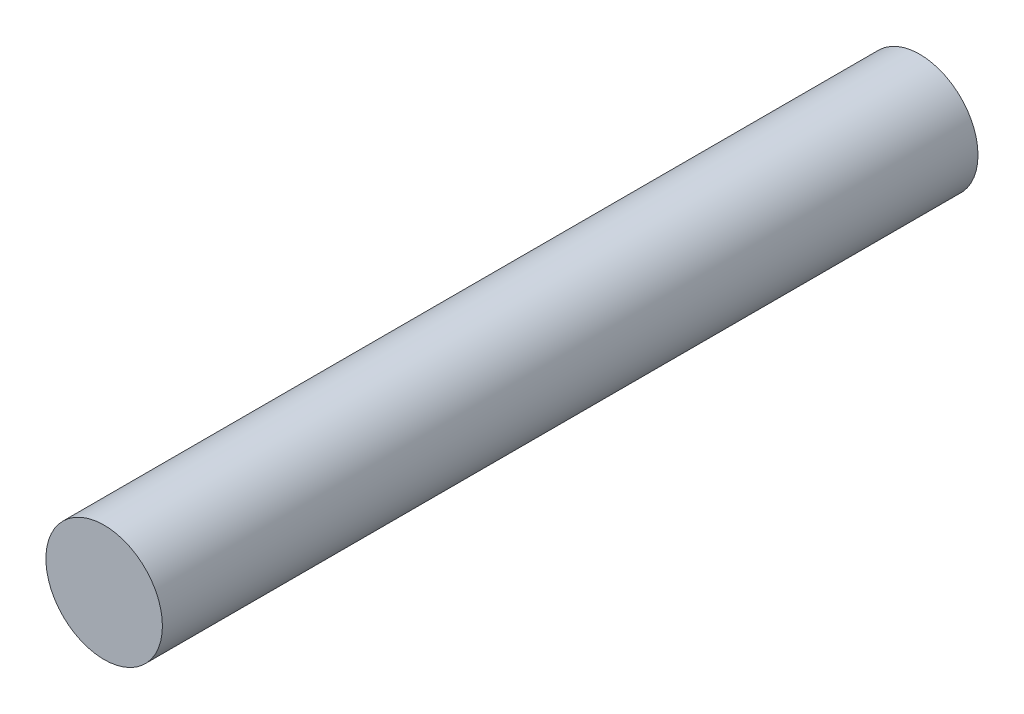
ISO-10303-21;
HEADER;
FILE_DESCRIPTION(('STEP AP214'),'2;1');
FILE_NAME('part.step','',(''),(''),'','','');
FILE_SCHEMA(('AUTOMOTIVE_DESIGN { 1 0 10303 214 1 1 1 1 }'));
ENDSEC;
DATA;
#1=APPLICATION_CONTEXT('core data for automotive mechanical design processes');
#2=APPLICATION_PROTOCOL_DEFINITION('international standard','automotive_design',2000,#1);
#3=PRODUCT_CONTEXT('',#1,'mechanical');
#4=PRODUCT('Part','Part','',(#3));
#5=PRODUCT_RELATED_PRODUCT_CATEGORY('part','',(#4));
#6=PRODUCT_DEFINITION_FORMATION('','',#4);
#7=PRODUCT_DEFINITION_CONTEXT('part definition',#1,'design');
#8=PRODUCT_DEFINITION('design','',#6,#7);
#9=PRODUCT_DEFINITION_SHAPE('','',#8);
#10=(LENGTH_UNIT() NAMED_UNIT(*) SI_UNIT(.MILLI.,.METRE.));
#11=(NAMED_UNIT(*) PLANE_ANGLE_UNIT() SI_UNIT($,.RADIAN.));
#12=(NAMED_UNIT(*) SI_UNIT($,.STERADIAN.) SOLID_ANGLE_UNIT());
#13=UNCERTAINTY_MEASURE_WITH_UNIT(LENGTH_MEASURE(1.E-05),#10,'distance_accuracy_value','');
#14=(GEOMETRIC_REPRESENTATION_CONTEXT(3) GLOBAL_UNCERTAINTY_ASSIGNED_CONTEXT((#13)) GLOBAL_UNIT_ASSIGNED_CONTEXT((#10,
#11,#12)) REPRESENTATION_CONTEXT('',''));
#15=CARTESIAN_POINT('',(0.,0.,0.));
#16=DIRECTION('',(0.,0.,1.));
#17=DIRECTION('',(1.,0.,0.));
#18=AXIS2_PLACEMENT_3D('',#15,#16,#17);
#19=CARTESIAN_POINT('',(-736.6,-12.6999999999999,88.9));
#20=DIRECTION('',(0.,0.,-1.));
#21=DIRECTION('',(-1.,0.,0.));
#22=AXIS2_PLACEMENT_3D('',#19,#20,#21);
#23=CYLINDRICAL_SURFACE('',#22,6.35000000000005);
#24=CARTESIAN_POINT('',(-736.6,-12.6999999999999,88.9));
#25=DIRECTION('',(0.,0.,1.));
#26=DIRECTION('',(1.,0.,0.));
#27=AXIS2_PLACEMENT_3D('',#24,#25,#26);
#28=CIRCLE('',#27,6.35000000000005);
#29=CARTESIAN_POINT('',(-730.25,-12.6999999999999,88.9));
#30=VERTEX_POINT('',#29);
#31=EDGE_CURVE('E10',#30,#30,#28,.T.);
#32=ORIENTED_EDGE('',*,*,#31,.F.);
#33=EDGE_LOOP('',(#32));
#34=FACE_BOUND('',#33,.T.);
#35=CARTESIAN_POINT('',(-736.6,-12.6999999999999,0.));
#36=DIRECTION('',(0.,0.,1.));
#37=DIRECTION('',(1.,0.,0.));
#38=AXIS2_PLACEMENT_3D('',#35,#36,#37);
#39=CIRCLE('',#38,6.35000000000005);
#40=CARTESIAN_POINT('',(-730.25,-12.6999999999999,0.));
#41=VERTEX_POINT('',#40);
#42=EDGE_CURVE('E36',#41,#41,#39,.T.);
#43=ORIENTED_EDGE('',*,*,#42,.T.);
#44=EDGE_LOOP('',(#43));
#45=FACE_BOUND('',#44,.T.);
#46=ADVANCED_FACE('F33',(#34,#45),#23,.T.);
#47=CARTESIAN_POINT('',(-736.6,-12.6999999999999,88.9));
#48=DIRECTION('',(0.,0.,1.));
#49=DIRECTION('',(1.,0.,0.));
#50=AXIS2_PLACEMENT_3D('',#47,#48,#49);
#51=PLANE('',#50);
#52=ORIENTED_EDGE('',*,*,#31,.T.);
#53=EDGE_LOOP('',(#52));
#54=FACE_BOUND('',#53,.T.);
#55=ADVANCED_FACE('F48',(#54),#51,.T.);
#56=CARTESIAN_POINT('',(-736.6,-12.6999999999999,0.));
#57=DIRECTION('',(0.,0.,1.));
#58=DIRECTION('',(1.,0.,0.));
#59=AXIS2_PLACEMENT_3D('',#56,#57,#58);
#60=PLANE('',#59);
#61=ORIENTED_EDGE('',*,*,#42,.F.);
#62=EDGE_LOOP('',(#61));
#63=FACE_BOUND('',#62,.T.);
#64=ADVANCED_FACE('F46',(#63),#60,.F.);
#65=CLOSED_SHELL('',(#46,#55,#64));
#66=MANIFOLD_SOLID_BREP('B2',#65);
#67=ADVANCED_BREP_SHAPE_REPRESENTATION('',(#18,#66),#14);
#68=SHAPE_DEFINITION_REPRESENTATION(#9,#67);
ENDSEC;
END-ISO-10303-21;
